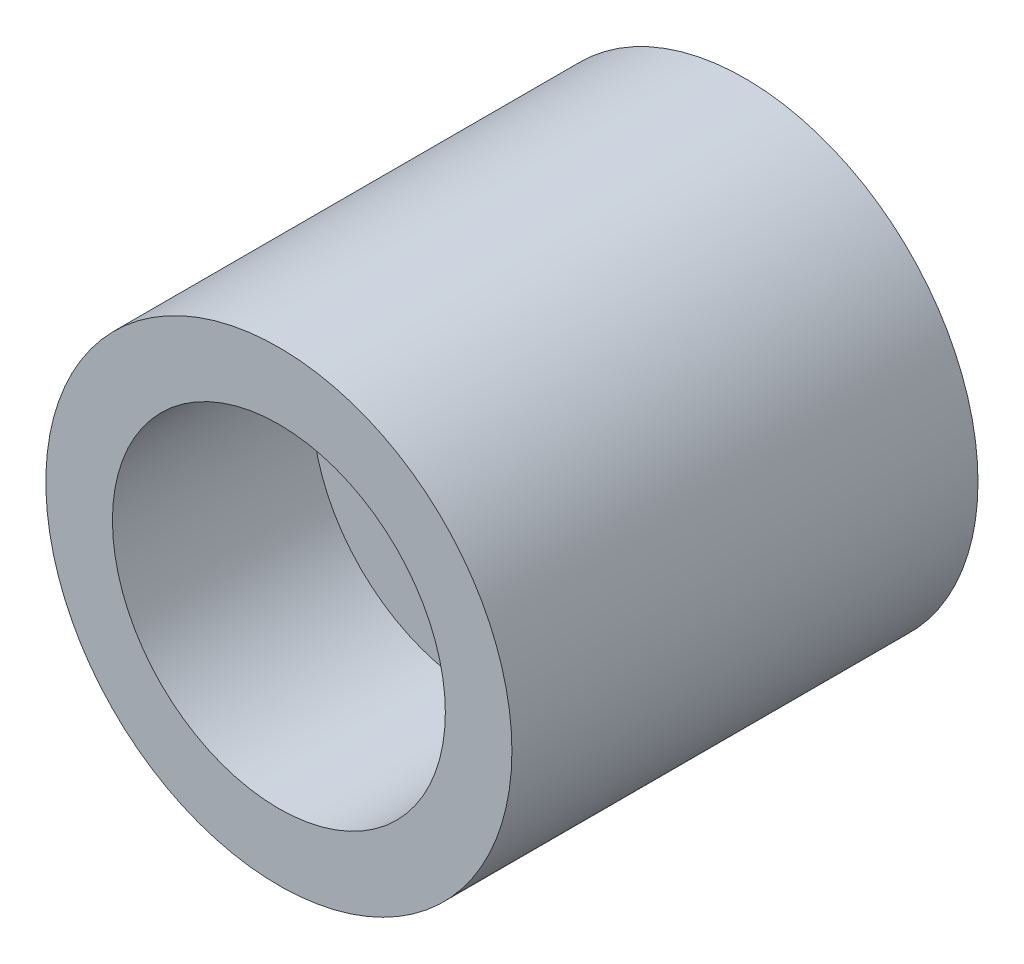
ISO-10303-21;
HEADER;
FILE_DESCRIPTION(('STEP AP214'),'2;1');
FILE_NAME('part.step','',(''),(''),'','','');
FILE_SCHEMA(('AUTOMOTIVE_DESIGN { 1 0 10303 214 1 1 1 1 }'));
ENDSEC;
DATA;
#1=APPLICATION_CONTEXT('core data for automotive mechanical design processes');
#2=APPLICATION_PROTOCOL_DEFINITION('international standard','automotive_design',2000,#1);
#3=PRODUCT_CONTEXT('',#1,'mechanical');
#4=PRODUCT('Part','Part','',(#3));
#5=PRODUCT_RELATED_PRODUCT_CATEGORY('part','',(#4));
#6=PRODUCT_DEFINITION_FORMATION('','',#4);
#7=PRODUCT_DEFINITION_CONTEXT('part definition',#1,'design');
#8=PRODUCT_DEFINITION('design','',#6,#7);
#9=PRODUCT_DEFINITION_SHAPE('','',#8);
#10=(LENGTH_UNIT() NAMED_UNIT(*) SI_UNIT(.MILLI.,.METRE.));
#11=(NAMED_UNIT(*) PLANE_ANGLE_UNIT() SI_UNIT($,.RADIAN.));
#12=(NAMED_UNIT(*) SI_UNIT($,.STERADIAN.) SOLID_ANGLE_UNIT());
#13=UNCERTAINTY_MEASURE_WITH_UNIT(LENGTH_MEASURE(1.E-05),#10,'distance_accuracy_value','');
#14=(GEOMETRIC_REPRESENTATION_CONTEXT(3) GLOBAL_UNCERTAINTY_ASSIGNED_CONTEXT((#13)) GLOBAL_UNIT_ASSIGNED_CONTEXT((#10,
#11,#12)) REPRESENTATION_CONTEXT('',''));
#15=CARTESIAN_POINT('',(0.,0.,0.));
#16=DIRECTION('',(0.,0.,1.));
#17=DIRECTION('',(1.,0.,0.));
#18=AXIS2_PLACEMENT_3D('',#15,#16,#17);
#19=CARTESIAN_POINT('',(0.,0.,177.8));
#20=DIRECTION('',(0.,0.,-1.));
#21=DIRECTION('',(-1.,0.,0.));
#22=AXIS2_PLACEMENT_3D('',#19,#20,#21);
#23=CYLINDRICAL_SURFACE('',#22,88.9);
#24=CARTESIAN_POINT('',(0.,0.,177.8));
#25=DIRECTION('',(0.,0.,1.));
#26=DIRECTION('',(1.,0.,0.));
#27=AXIS2_PLACEMENT_3D('',#24,#25,#26);
#28=CIRCLE('',#27,88.9);
#29=CARTESIAN_POINT('',(88.9,0.,177.8));
#30=VERTEX_POINT('',#29);
#31=EDGE_CURVE('E10',#30,#30,#28,.T.);
#32=ORIENTED_EDGE('',*,*,#31,.F.);
#33=EDGE_LOOP('',(#32));
#34=FACE_BOUND('',#33,.T.);
#35=CARTESIAN_POINT('',(0.,0.,0.));
#36=DIRECTION('',(0.,0.,1.));
#37=DIRECTION('',(1.,0.,0.));
#38=AXIS2_PLACEMENT_3D('',#35,#36,#37);
#39=CIRCLE('',#38,88.9);
#40=CARTESIAN_POINT('',(88.9,0.,0.));
#41=VERTEX_POINT('',#40);
#42=EDGE_CURVE('E34',#41,#41,#39,.T.);
#43=ORIENTED_EDGE('',*,*,#42,.T.);
#44=EDGE_LOOP('',(#43));
#45=FACE_BOUND('',#44,.T.);
#46=ADVANCED_FACE('F31',(#34,#45),#23,.T.);
#47=CARTESIAN_POINT('',(0.,0.,177.8));
#48=DIRECTION('',(0.,0.,1.));
#49=DIRECTION('',(1.,0.,0.));
#50=AXIS2_PLACEMENT_3D('',#47,#48,#49);
#51=PLANE('',#50);
#52=CARTESIAN_POINT('',(0.,0.,177.8));
#53=DIRECTION('',(0.,0.,1.));
#54=DIRECTION('',(1.,0.,0.));
#55=AXIS2_PLACEMENT_3D('',#52,#53,#54);
#56=CIRCLE('',#55,63.5);
#57=CARTESIAN_POINT('',(63.5,0.,177.8));
#58=VERTEX_POINT('',#57);
#59=EDGE_CURVE('E43',#58,#58,#56,.T.);
#60=ORIENTED_EDGE('',*,*,#59,.F.);
#61=EDGE_LOOP('',(#60));
#62=FACE_BOUND('',#61,.T.);
#63=ORIENTED_EDGE('',*,*,#31,.T.);
#64=EDGE_LOOP('',(#63));
#65=FACE_BOUND('',#64,.T.);
#66=ADVANCED_FACE('F68',(#62,#65),#51,.T.);
#67=CARTESIAN_POINT('',(0.,0.,0.));
#68=DIRECTION('',(0.,0.,1.));
#69=DIRECTION('',(1.,0.,0.));
#70=AXIS2_PLACEMENT_3D('',#67,#68,#69);
#71=PLANE('',#70);
#72=CARTESIAN_POINT('',(0.,0.,0.));
#73=DIRECTION('',(0.,0.,-1.));
#74=DIRECTION('',(-1.,0.,0.));
#75=AXIS2_PLACEMENT_3D('',#72,#73,#74);
#76=CIRCLE('',#75,63.5);
#77=CARTESIAN_POINT('',(-63.5,0.,0.));
#78=VERTEX_POINT('',#77);
#79=EDGE_CURVE('E49',#78,#78,#76,.T.);
#80=ORIENTED_EDGE('',*,*,#79,.F.);
#81=EDGE_LOOP('',(#80));
#82=FACE_BOUND('',#81,.T.);
#83=ORIENTED_EDGE('',*,*,#42,.F.);
#84=EDGE_LOOP('',(#83));
#85=FACE_BOUND('',#84,.T.);
#86=ADVANCED_FACE('F64',(#82,#85),#71,.F.);
#87=CARTESIAN_POINT('',(0.,0.,101.6));
#88=DIRECTION('',(0.,0.,1.));
#89=DIRECTION('',(1.,0.,0.));
#90=AXIS2_PLACEMENT_3D('',#87,#88,#89);
#91=CYLINDRICAL_SURFACE('',#90,63.5);
#92=CARTESIAN_POINT('',(0.,0.,101.6));
#93=DIRECTION('',(0.,0.,1.));
#94=DIRECTION('',(1.,0.,0.));
#95=AXIS2_PLACEMENT_3D('',#92,#93,#94);
#96=CIRCLE('',#95,63.5);
#97=CARTESIAN_POINT('',(63.5,0.,101.6));
#98=VERTEX_POINT('',#97);
#99=EDGE_CURVE('E41',#98,#98,#96,.T.);
#100=CARTESIAN_POINT('',(63.5,0.,101.6));
#101=CARTESIAN_POINT('',(63.5,0.,102.39375));
#102=CARTESIAN_POINT('',(63.5,0.,103.1875));
#103=CARTESIAN_POINT('',(63.5,0.,104.775));
#104=CARTESIAN_POINT('',(63.5,0.,105.56875));
#105=CARTESIAN_POINT('',(63.5,0.,107.15625));
#106=CARTESIAN_POINT('',(63.5,0.,107.95));
#107=CARTESIAN_POINT('',(63.5,0.,109.5375));
#108=CARTESIAN_POINT('',(63.5,0.,110.33125));
#109=CARTESIAN_POINT('',(63.5,0.,111.91875));
#110=CARTESIAN_POINT('',(63.5,0.,112.7125));
#111=CARTESIAN_POINT('',(63.5,0.,114.3));
#112=CARTESIAN_POINT('',(63.5,0.,115.09375));
#113=CARTESIAN_POINT('',(63.5,0.,116.68125));
#114=CARTESIAN_POINT('',(63.5,0.,117.475));
#115=CARTESIAN_POINT('',(63.5,0.,119.0625));
#116=CARTESIAN_POINT('',(63.5,0.,119.85625));
#117=CARTESIAN_POINT('',(63.5,0.,121.44375));
#118=CARTESIAN_POINT('',(63.5,0.,122.2375));
#119=CARTESIAN_POINT('',(63.5,0.,123.825));
#120=CARTESIAN_POINT('',(63.5,0.,124.61875));
#121=CARTESIAN_POINT('',(63.5,0.,126.20625));
#122=CARTESIAN_POINT('',(63.5,0.,127.));
#123=CARTESIAN_POINT('',(63.5,0.,128.5875));
#124=CARTESIAN_POINT('',(63.5,0.,129.38125));
#125=CARTESIAN_POINT('',(63.5,0.,130.96875));
#126=CARTESIAN_POINT('',(63.5,0.,131.7625));
#127=CARTESIAN_POINT('',(63.5,0.,133.35));
#128=CARTESIAN_POINT('',(63.5,0.,134.14375));
#129=CARTESIAN_POINT('',(63.5,0.,135.73125));
#130=CARTESIAN_POINT('',(63.5,0.,136.525));
#131=CARTESIAN_POINT('',(63.5,0.,138.1125));
#132=CARTESIAN_POINT('',(63.5,0.,138.90625));
#133=CARTESIAN_POINT('',(63.5,0.,140.49375));
#134=CARTESIAN_POINT('',(63.5,0.,141.2875));
#135=CARTESIAN_POINT('',(63.5,0.,142.875));
#136=CARTESIAN_POINT('',(63.5,0.,143.66875));
#137=CARTESIAN_POINT('',(63.5,0.,145.25625));
#138=CARTESIAN_POINT('',(63.5,0.,146.05));
#139=CARTESIAN_POINT('',(63.5,0.,147.6375));
#140=CARTESIAN_POINT('',(63.5,0.,148.43125));
#141=CARTESIAN_POINT('',(63.5,0.,150.01875));
#142=CARTESIAN_POINT('',(63.5,0.,150.8125));
#143=CARTESIAN_POINT('',(63.5,0.,152.4));
#144=CARTESIAN_POINT('',(63.5,0.,153.19375));
#145=CARTESIAN_POINT('',(63.5,0.,154.78125));
#146=CARTESIAN_POINT('',(63.5,0.,155.575));
#147=CARTESIAN_POINT('',(63.5,0.,157.1625));
#148=CARTESIAN_POINT('',(63.5,0.,157.95625));
#149=CARTESIAN_POINT('',(63.5,0.,159.54375));
#150=CARTESIAN_POINT('',(63.5,0.,160.3375));
#151=CARTESIAN_POINT('',(63.5,0.,161.925));
#152=CARTESIAN_POINT('',(63.5,0.,162.71875));
#153=CARTESIAN_POINT('',(63.5,0.,164.30625));
#154=CARTESIAN_POINT('',(63.5,0.,165.1));
#155=CARTESIAN_POINT('',(63.5,0.,166.6875));
#156=CARTESIAN_POINT('',(63.5,0.,167.48125));
#157=CARTESIAN_POINT('',(63.5,0.,169.06875));
#158=CARTESIAN_POINT('',(63.5,0.,169.8625));
#159=CARTESIAN_POINT('',(63.5,0.,171.45));
#160=CARTESIAN_POINT('',(63.5,0.,172.24375));
#161=CARTESIAN_POINT('',(63.5,0.,173.83125));
#162=CARTESIAN_POINT('',(63.5,0.,174.625));
#163=CARTESIAN_POINT('',(63.5,0.,176.2125));
#164=CARTESIAN_POINT('',(63.5,0.,177.00625));
#165=CARTESIAN_POINT('',(63.5,0.,177.8));
#166=B_SPLINE_CURVE_WITH_KNOTS('',3,(#100,#101,#102,#103,#104,#105,#106,#107,#108,#109,#110,
#111,#112,#113,#114,#115,#116,#117,#118,#119,#120,#121,#122,#123,#124,#125,#126,#127,#128,#129,
#130,#131,#132,#133,#134,#135,#136,#137,#138,#139,#140,#141,#142,#143,#144,#145,#146,#147,#148,
#149,#150,#151,#152,#153,#154,#155,#156,#157,#158,#159,#160,#161,#162,#163,#164,#165),
.UNSPECIFIED.,.F.,.F.,(4,2,2,2,2,2,2,2,2,2,2,2,2,2,2,2,2,2,2,2,2,2,2,2,2,2,2,2,2,2,2,2,4),(0.,
2.38124999999999,4.76249999999999,7.14374999999999,9.52499999999999,11.90625,14.2875,16.66875,
19.05,21.43125,23.8125,26.19375,28.575,30.95625,33.3375,35.71875,38.1,40.48125,42.8625,45.24375,
47.625,50.00625,52.3875,54.76875,57.15,59.53125,61.9125,64.29375,66.675,69.05625,71.4375,
73.81875,76.2),.UNSPECIFIED.);
#167=EDGE_CURVE('BSEAM67',#98,#58,#166,.T.);
#168=ORIENTED_EDGE('',*,*,#99,.F.);
#169=ORIENTED_EDGE('',*,*,#59,.T.);
#170=ORIENTED_EDGE('',*,*,#167,.T.);
#171=ORIENTED_EDGE('',*,*,#167,.F.);
#172=EDGE_LOOP('',(#168,#170,#169,#171));
#173=FACE_BOUND('',#172,.T.);
#174=ADVANCED_FACE('F67',(#173),#91,.F.);
#175=CARTESIAN_POINT('',(0.,0.,101.6));
#176=DIRECTION('',(0.,0.,1.));
#177=DIRECTION('',(1.,0.,0.));
#178=AXIS2_PLACEMENT_3D('',#175,#176,#177);
#179=PLANE('',#178);
#180=ORIENTED_EDGE('',*,*,#99,.T.);
#181=EDGE_LOOP('',(#180));
#182=FACE_BOUND('',#181,.T.);
#183=ADVANCED_FACE('F60',(#182),#179,.T.);
#184=CARTESIAN_POINT('',(0.,0.,76.2));
#185=DIRECTION('',(0.,0.,-1.));
#186=DIRECTION('',(-1.,0.,0.));
#187=AXIS2_PLACEMENT_3D('',#184,#185,#186);
#188=CYLINDRICAL_SURFACE('',#187,63.5);
#189=CARTESIAN_POINT('',(0.,0.,76.2));
#190=DIRECTION('',(0.,0.,-1.));
#191=DIRECTION('',(-1.,0.,0.));
#192=AXIS2_PLACEMENT_3D('',#189,#190,#191);
#193=CIRCLE('',#192,63.5);
#194=CARTESIAN_POINT('',(-63.5,0.,76.2));
#195=VERTEX_POINT('',#194);
#196=EDGE_CURVE('E46',#195,#195,#193,.T.);
#197=CARTESIAN_POINT('',(-63.5,0.,76.2));
#198=CARTESIAN_POINT('',(-63.5,0.,75.40625));
#199=CARTESIAN_POINT('',(-63.5,0.,74.6125));
#200=CARTESIAN_POINT('',(-63.5,0.,73.025));
#201=CARTESIAN_POINT('',(-63.5,0.,72.23125));
#202=CARTESIAN_POINT('',(-63.5,0.,70.64375));
#203=CARTESIAN_POINT('',(-63.5,0.,69.85));
#204=CARTESIAN_POINT('',(-63.5,0.,68.2625));
#205=CARTESIAN_POINT('',(-63.5,0.,67.46875));
#206=CARTESIAN_POINT('',(-63.5,0.,65.88125));
#207=CARTESIAN_POINT('',(-63.5,0.,65.0875));
#208=CARTESIAN_POINT('',(-63.5,0.,63.5));
#209=CARTESIAN_POINT('',(-63.5,0.,62.70625));
#210=CARTESIAN_POINT('',(-63.5,0.,61.11875));
#211=CARTESIAN_POINT('',(-63.5,0.,60.325));
#212=CARTESIAN_POINT('',(-63.5,0.,58.7375));
#213=CARTESIAN_POINT('',(-63.5,0.,57.94375));
#214=CARTESIAN_POINT('',(-63.5,0.,56.35625));
#215=CARTESIAN_POINT('',(-63.5,0.,55.5625));
#216=CARTESIAN_POINT('',(-63.5,0.,53.975));
#217=CARTESIAN_POINT('',(-63.5,0.,53.18125));
#218=CARTESIAN_POINT('',(-63.5,0.,51.59375));
#219=CARTESIAN_POINT('',(-63.5,0.,50.8));
#220=CARTESIAN_POINT('',(-63.5,0.,49.2125));
#221=CARTESIAN_POINT('',(-63.5,0.,48.41875));
#222=CARTESIAN_POINT('',(-63.5,0.,46.83125));
#223=CARTESIAN_POINT('',(-63.5,0.,46.0375));
#224=CARTESIAN_POINT('',(-63.5,0.,44.45));
#225=CARTESIAN_POINT('',(-63.5,0.,43.65625));
#226=CARTESIAN_POINT('',(-63.5,0.,42.06875));
#227=CARTESIAN_POINT('',(-63.5,0.,41.275));
#228=CARTESIAN_POINT('',(-63.5,0.,39.6875));
#229=CARTESIAN_POINT('',(-63.5,0.,38.89375));
#230=CARTESIAN_POINT('',(-63.5,0.,37.30625));
#231=CARTESIAN_POINT('',(-63.5,0.,36.5125));
#232=CARTESIAN_POINT('',(-63.5,0.,34.925));
#233=CARTESIAN_POINT('',(-63.5,0.,34.13125));
#234=CARTESIAN_POINT('',(-63.5,0.,32.54375));
#235=CARTESIAN_POINT('',(-63.5,0.,31.75));
#236=CARTESIAN_POINT('',(-63.5,0.,30.1625));
#237=CARTESIAN_POINT('',(-63.5,0.,29.36875));
#238=CARTESIAN_POINT('',(-63.5,0.,27.78125));
#239=CARTESIAN_POINT('',(-63.5,0.,26.9875));
#240=CARTESIAN_POINT('',(-63.5,0.,25.4));
#241=CARTESIAN_POINT('',(-63.5,0.,24.60625));
#242=CARTESIAN_POINT('',(-63.5,0.,23.01875));
#243=CARTESIAN_POINT('',(-63.5,0.,22.225));
#244=CARTESIAN_POINT('',(-63.5,0.,20.6375));
#245=CARTESIAN_POINT('',(-63.5,0.,19.84375));
#246=CARTESIAN_POINT('',(-63.5,0.,18.25625));
#247=CARTESIAN_POINT('',(-63.5,0.,17.4625));
#248=CARTESIAN_POINT('',(-63.5,0.,15.875));
#249=CARTESIAN_POINT('',(-63.5,0.,15.08125));
#250=CARTESIAN_POINT('',(-63.5,0.,13.49375));
#251=CARTESIAN_POINT('',(-63.5,0.,12.7));
#252=CARTESIAN_POINT('',(-63.5,0.,11.1125));
#253=CARTESIAN_POINT('',(-63.5,0.,10.31875));
#254=CARTESIAN_POINT('',(-63.5,0.,8.73125));
#255=CARTESIAN_POINT('',(-63.5,0.,7.93750000000001));
#256=CARTESIAN_POINT('',(-63.5,0.,6.35));
#257=CARTESIAN_POINT('',(-63.5,0.,5.55625));
#258=CARTESIAN_POINT('',(-63.5,0.,3.96875));
#259=CARTESIAN_POINT('',(-63.5,0.,3.175));
#260=CARTESIAN_POINT('',(-63.5,0.,1.5875));
#261=CARTESIAN_POINT('',(-63.5,0.,0.793750000000001));
#262=CARTESIAN_POINT('',(-63.5,0.,0.));
#263=B_SPLINE_CURVE_WITH_KNOTS('',3,(#197,#198,#199,#200,#201,#202,#203,#204,#205,#206,#207,
#208,#209,#210,#211,#212,#213,#214,#215,#216,#217,#218,#219,#220,#221,#222,#223,#224,#225,#226,
#227,#228,#229,#230,#231,#232,#233,#234,#235,#236,#237,#238,#239,#240,#241,#242,#243,#244,#245,
#246,#247,#248,#249,#250,#251,#252,#253,#254,#255,#256,#257,#258,#259,#260,#261,#262),
.UNSPECIFIED.,.F.,.F.,(4,2,2,2,2,2,2,2,2,2,2,2,2,2,2,2,2,2,2,2,2,2,2,2,2,2,2,2,2,2,2,2,4),(0.,
2.38124999999999,4.76249999999999,7.14374999999999,9.52499999999999,11.90625,14.2875,16.66875,
19.05,21.43125,23.8125,26.19375,28.575,30.95625,33.3375,35.71875,38.1,40.48125,42.8625,45.24375,
47.625,50.00625,52.3875,54.76875,57.15,59.53125,61.9125,64.29375,66.675,69.05625,71.4375,
73.81875,76.2),.UNSPECIFIED.);
#264=EDGE_CURVE('BSEAM57',#195,#78,#263,.T.);
#265=ORIENTED_EDGE('',*,*,#196,.F.);
#266=ORIENTED_EDGE('',*,*,#79,.T.);
#267=ORIENTED_EDGE('',*,*,#264,.T.);
#268=ORIENTED_EDGE('',*,*,#264,.F.);
#269=EDGE_LOOP('',(#265,#267,#266,#268));
#270=FACE_BOUND('',#269,.T.);
#271=ADVANCED_FACE('F57',(#270),#188,.F.);
#272=CARTESIAN_POINT('',(0.,0.,76.2));
#273=DIRECTION('',(0.,0.,-1.));
#274=DIRECTION('',(-1.,0.,0.));
#275=AXIS2_PLACEMENT_3D('',#272,#273,#274);
#276=PLANE('',#275);
#277=ORIENTED_EDGE('',*,*,#196,.T.);
#278=EDGE_LOOP('',(#277));
#279=FACE_BOUND('',#278,.T.);
#280=ADVANCED_FACE('F55',(#279),#276,.T.);
#281=CLOSED_SHELL('',(#46,#66,#86,#174,#183,#271,#280));
#282=MANIFOLD_SOLID_BREP('B2',#281);
#283=ADVANCED_BREP_SHAPE_REPRESENTATION('',(#18,#282),#14);
#284=SHAPE_DEFINITION_REPRESENTATION(#9,#283);
ENDSEC;
END-ISO-10303-21;
